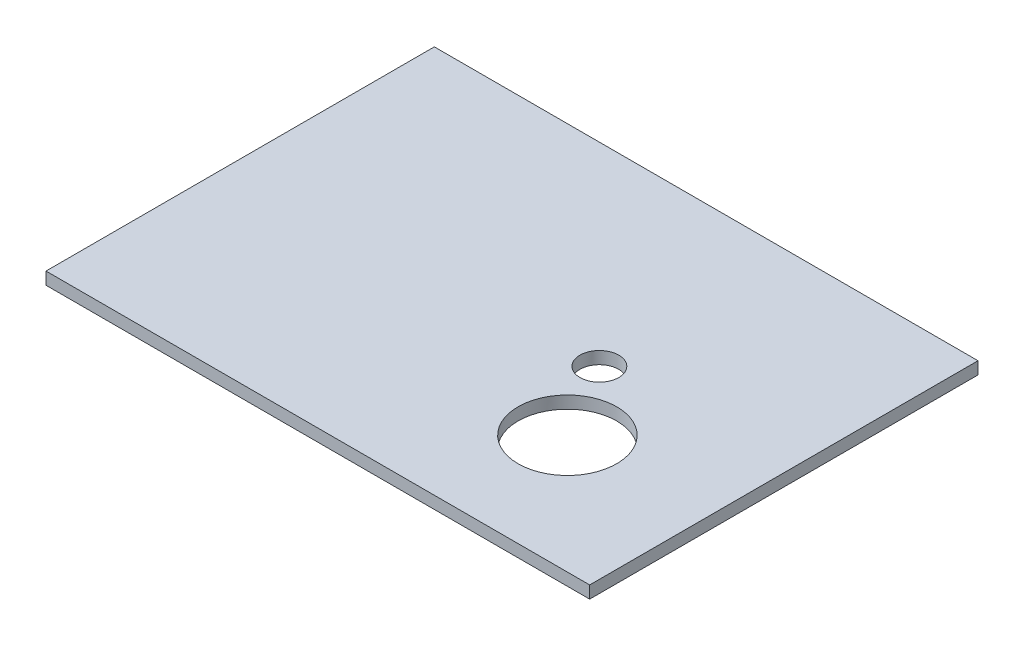
ISO-10303-21;
HEADER;
FILE_DESCRIPTION(('STEP AP214'),'2;1');
FILE_NAME('part.step','',(''),(''),'','','');
FILE_SCHEMA(('AUTOMOTIVE_DESIGN { 1 0 10303 214 1 1 1 1 }'));
ENDSEC;
DATA;
#1=APPLICATION_CONTEXT('core data for automotive mechanical design processes');
#2=APPLICATION_PROTOCOL_DEFINITION('international standard','automotive_design',2000,#1);
#3=PRODUCT_CONTEXT('',#1,'mechanical');
#4=PRODUCT('Part','Part','',(#3));
#5=PRODUCT_RELATED_PRODUCT_CATEGORY('part','',(#4));
#6=PRODUCT_DEFINITION_FORMATION('','',#4);
#7=PRODUCT_DEFINITION_CONTEXT('part definition',#1,'design');
#8=PRODUCT_DEFINITION('design','',#6,#7);
#9=PRODUCT_DEFINITION_SHAPE('','',#8);
#10=(LENGTH_UNIT() NAMED_UNIT(*) SI_UNIT(.MILLI.,.METRE.));
#11=(NAMED_UNIT(*) PLANE_ANGLE_UNIT() SI_UNIT($,.RADIAN.));
#12=(NAMED_UNIT(*) SI_UNIT($,.STERADIAN.) SOLID_ANGLE_UNIT());
#13=UNCERTAINTY_MEASURE_WITH_UNIT(LENGTH_MEASURE(1.E-05),#10,'distance_accuracy_value','');
#14=(GEOMETRIC_REPRESENTATION_CONTEXT(3) GLOBAL_UNCERTAINTY_ASSIGNED_CONTEXT((#13)) GLOBAL_UNIT_ASSIGNED_CONTEXT((#10,
#11,#12)) REPRESENTATION_CONTEXT('',''));
#15=CARTESIAN_POINT('',(0.,0.,0.));
#16=DIRECTION('',(0.,0.,1.));
#17=DIRECTION('',(1.,0.,0.));
#18=AXIS2_PLACEMENT_3D('',#15,#16,#17);
#19=CARTESIAN_POINT('',(0.,3.175,0.));
#20=DIRECTION('',(1.,0.,0.));
#21=DIRECTION('',(0.,0.,-1.));
#22=AXIS2_PLACEMENT_3D('',#19,#20,#21);
#23=PLANE('',#22);
#24=DIRECTION('',(0.,0.,1.));
#25=VECTOR('',#24,1.);
#26=CARTESIAN_POINT('',(0.,0.,0.));
#27=LINE('',#26,#25);
#28=CARTESIAN_POINT('',(0.,0.,-100.));
#29=VERTEX_POINT('',#28);
#30=CARTESIAN_POINT('',(0.,0.,0.));
#31=VERTEX_POINT('',#30);
#32=EDGE_CURVE('E99',#29,#31,#27,.T.);
#33=ORIENTED_EDGE('',*,*,#32,.T.);
#34=DIRECTION('',(0.,-1.,0.));
#35=VECTOR('',#34,1.);
#36=CARTESIAN_POINT('',(0.,3.175,0.));
#37=LINE('',#36,#35);
#38=CARTESIAN_POINT('',(0.,3.175,0.));
#39=VERTEX_POINT('',#38);
#40=EDGE_CURVE('E11',#39,#31,#37,.T.);
#41=ORIENTED_EDGE('',*,*,#40,.F.);
#42=DIRECTION('',(0.,0.,1.));
#43=VECTOR('',#42,1.);
#44=CARTESIAN_POINT('',(0.,3.175,0.));
#45=LINE('',#44,#43);
#46=CARTESIAN_POINT('',(0.,3.175,-100.));
#47=VERTEX_POINT('',#46);
#48=EDGE_CURVE('E86',#47,#39,#45,.T.);
#49=ORIENTED_EDGE('',*,*,#48,.F.);
#50=DIRECTION('',(0.,-1.,0.));
#51=VECTOR('',#50,1.);
#52=CARTESIAN_POINT('',(0.,3.175,-100.));
#53=LINE('',#52,#51);
#54=EDGE_CURVE('E95',#47,#29,#53,.T.);
#55=ORIENTED_EDGE('',*,*,#54,.T.);
#56=EDGE_LOOP('',(#33,#41,#49,#55));
#57=FACE_BOUND('',#56,.T.);
#58=ADVANCED_FACE('F33',(#57),#23,.F.);
#59=CARTESIAN_POINT('',(0.,3.175,0.));
#60=DIRECTION('',(0.,0.,-1.));
#61=DIRECTION('',(-1.,0.,0.));
#62=AXIS2_PLACEMENT_3D('',#59,#60,#61);
#63=PLANE('',#62);
#64=DIRECTION('',(1.,0.,0.));
#65=VECTOR('',#64,1.);
#66=CARTESIAN_POINT('',(0.,0.,0.));
#67=LINE('',#66,#65);
#68=CARTESIAN_POINT('',(140.,0.,0.));
#69=VERTEX_POINT('',#68);
#70=EDGE_CURVE('E90',#31,#69,#67,.T.);
#71=ORIENTED_EDGE('',*,*,#70,.T.);
#72=DIRECTION('',(0.,-1.,0.));
#73=VECTOR('',#72,1.);
#74=CARTESIAN_POINT('',(140.,3.175,0.));
#75=LINE('',#74,#73);
#76=CARTESIAN_POINT('',(140.,3.175,0.));
#77=VERTEX_POINT('',#76);
#78=EDGE_CURVE('E42',#77,#69,#75,.T.);
#79=ORIENTED_EDGE('',*,*,#78,.F.);
#80=DIRECTION('',(1.,0.,0.));
#81=VECTOR('',#80,1.);
#82=CARTESIAN_POINT('',(0.,3.175,0.));
#83=LINE('',#82,#81);
#84=EDGE_CURVE('E81',#39,#77,#83,.T.);
#85=ORIENTED_EDGE('',*,*,#84,.F.);
#86=ORIENTED_EDGE('',*,*,#40,.T.);
#87=EDGE_LOOP('',(#71,#79,#85,#86));
#88=FACE_BOUND('',#87,.T.);
#89=ADVANCED_FACE('F89',(#88),#63,.F.);
#90=CARTESIAN_POINT('',(140.,3.175,0.));
#91=DIRECTION('',(-1.,0.,0.));
#92=DIRECTION('',(0.,0.,1.));
#93=AXIS2_PLACEMENT_3D('',#90,#91,#92);
#94=PLANE('',#93);
#95=DIRECTION('',(0.,0.,-1.));
#96=VECTOR('',#95,1.);
#97=CARTESIAN_POINT('',(140.,0.,0.));
#98=LINE('',#97,#96);
#99=CARTESIAN_POINT('',(140.,0.,-100.));
#100=VERTEX_POINT('',#99);
#101=EDGE_CURVE('E68',#69,#100,#98,.T.);
#102=ORIENTED_EDGE('',*,*,#101,.T.);
#103=DIRECTION('',(0.,-1.,0.));
#104=VECTOR('',#103,1.);
#105=CARTESIAN_POINT('',(140.,3.175,-100.));
#106=LINE('',#105,#104);
#107=CARTESIAN_POINT('',(140.,3.175,-100.));
#108=VERTEX_POINT('',#107);
#109=EDGE_CURVE('E91',#108,#100,#106,.T.);
#110=ORIENTED_EDGE('',*,*,#109,.F.);
#111=DIRECTION('',(0.,0.,-1.));
#112=VECTOR('',#111,1.);
#113=CARTESIAN_POINT('',(140.,3.175,0.));
#114=LINE('',#113,#112);
#115=EDGE_CURVE('E84',#77,#108,#114,.T.);
#116=ORIENTED_EDGE('',*,*,#115,.F.);
#117=ORIENTED_EDGE('',*,*,#78,.T.);
#118=EDGE_LOOP('',(#102,#110,#116,#117));
#119=FACE_BOUND('',#118,.T.);
#120=ADVANCED_FACE('F93',(#119),#94,.F.);
#121=CARTESIAN_POINT('',(0.,3.175,-100.));
#122=DIRECTION('',(0.,0.,1.));
#123=DIRECTION('',(1.,0.,0.));
#124=AXIS2_PLACEMENT_3D('',#121,#122,#123);
#125=PLANE('',#124);
#126=DIRECTION('',(-1.,0.,0.));
#127=VECTOR('',#126,1.);
#128=CARTESIAN_POINT('',(0.,0.,-100.));
#129=LINE('',#128,#127);
#130=EDGE_CURVE('E74',#100,#29,#129,.T.);
#131=ORIENTED_EDGE('',*,*,#130,.T.);
#132=ORIENTED_EDGE('',*,*,#54,.F.);
#133=DIRECTION('',(-1.,0.,0.));
#134=VECTOR('',#133,1.);
#135=CARTESIAN_POINT('',(0.,3.175,-100.));
#136=LINE('',#135,#134);
#137=EDGE_CURVE('E51',#108,#47,#136,.T.);
#138=ORIENTED_EDGE('',*,*,#137,.F.);
#139=ORIENTED_EDGE('',*,*,#109,.T.);
#140=EDGE_LOOP('',(#131,#132,#138,#139));
#141=FACE_BOUND('',#140,.T.);
#142=ADVANCED_FACE('F125',(#141),#125,.F.);
#143=CARTESIAN_POINT('',(0.,3.175,0.));
#144=DIRECTION('',(0.,-1.,0.));
#145=DIRECTION('',(0.,0.,-1.));
#146=AXIS2_PLACEMENT_3D('',#143,#144,#145);
#147=PLANE('',#146);
#148=CARTESIAN_POINT('',(103.75,3.175,-30.5144284148501));
#149=DIRECTION('',(0.,1.,0.));
#150=DIRECTION('',(0.,0.,1.));
#151=AXIS2_PLACEMENT_3D('',#148,#149,#150);
#152=CIRCLE('',#151,12.705);
#153=CARTESIAN_POINT('',(103.75,3.175,-17.8094284148501));
#154=VERTEX_POINT('',#153);
#155=EDGE_CURVE('E108',#154,#154,#152,.T.);
#156=ORIENTED_EDGE('',*,*,#155,.F.);
#157=EDGE_LOOP('',(#156));
#158=FACE_BOUND('',#157,.T.);
#159=CARTESIAN_POINT('',(92.5,3.175,-50.));
#160=DIRECTION('',(0.,1.,0.));
#161=DIRECTION('',(0.,0.,1.));
#162=AXIS2_PLACEMENT_3D('',#159,#160,#161);
#163=CIRCLE('',#162,5.00000000000001);
#164=CARTESIAN_POINT('',(92.5,3.175,-45.));
#165=VERTEX_POINT('',#164);
#166=EDGE_CURVE('E113',#165,#165,#163,.T.);
#167=ORIENTED_EDGE('',*,*,#166,.F.);
#168=EDGE_LOOP('',(#167));
#169=FACE_BOUND('',#168,.T.);
#170=ORIENTED_EDGE('',*,*,#48,.T.);
#171=ORIENTED_EDGE('',*,*,#84,.T.);
#172=ORIENTED_EDGE('',*,*,#115,.T.);
#173=ORIENTED_EDGE('',*,*,#137,.T.);
#174=EDGE_LOOP('',(#170,#171,#172,#173));
#175=FACE_BOUND('',#174,.T.);
#176=ADVANCED_FACE('F82',(#158,#169,#175),#147,.F.);
#177=CARTESIAN_POINT('',(0.,0.,0.));
#178=DIRECTION('',(0.,-1.,0.));
#179=DIRECTION('',(0.,0.,-1.));
#180=AXIS2_PLACEMENT_3D('',#177,#178,#179);
#181=PLANE('',#180);
#182=CARTESIAN_POINT('',(103.75,0.,-30.5144284148501));
#183=DIRECTION('',(0.,-1.,0.));
#184=DIRECTION('',(0.,0.,-1.));
#185=AXIS2_PLACEMENT_3D('',#182,#183,#184);
#186=CIRCLE('',#185,12.705);
#187=CARTESIAN_POINT('',(103.75,0.,-43.2194284148501));
#188=VERTEX_POINT('',#187);
#189=EDGE_CURVE('E36',#188,#188,#186,.T.);
#190=ORIENTED_EDGE('',*,*,#189,.F.);
#191=EDGE_LOOP('',(#190));
#192=FACE_BOUND('',#191,.T.);
#193=CARTESIAN_POINT('',(92.5,0.,-50.));
#194=DIRECTION('',(0.,-1.,0.));
#195=DIRECTION('',(0.,0.,-1.));
#196=AXIS2_PLACEMENT_3D('',#193,#194,#195);
#197=CIRCLE('',#196,5.00000000000001);
#198=CARTESIAN_POINT('',(92.5,0.,-55.));
#199=VERTEX_POINT('',#198);
#200=EDGE_CURVE('E106',#199,#199,#197,.T.);
#201=ORIENTED_EDGE('',*,*,#200,.F.);
#202=EDGE_LOOP('',(#201));
#203=FACE_BOUND('',#202,.T.);
#204=ORIENTED_EDGE('',*,*,#32,.F.);
#205=ORIENTED_EDGE('',*,*,#130,.F.);
#206=ORIENTED_EDGE('',*,*,#101,.F.);
#207=ORIENTED_EDGE('',*,*,#70,.F.);
#208=EDGE_LOOP('',(#204,#205,#206,#207));
#209=FACE_BOUND('',#208,.T.);
#210=ADVANCED_FACE('F124',(#192,#203,#209),#181,.T.);
#211=CARTESIAN_POINT('',(92.5,-6.825,-50.));
#212=DIRECTION('',(0.,1.,0.));
#213=DIRECTION('',(0.,0.,1.));
#214=AXIS2_PLACEMENT_3D('',#211,#212,#213);
#215=CYLINDRICAL_SURFACE('',#214,5.00000000000001);
#216=ORIENTED_EDGE('',*,*,#200,.T.);
#217=EDGE_LOOP('',(#216));
#218=FACE_BOUND('',#217,.T.);
#219=ORIENTED_EDGE('',*,*,#166,.T.);
#220=EDGE_LOOP('',(#219));
#221=FACE_BOUND('',#220,.T.);
#222=ADVANCED_FACE('F121',(#218,#221),#215,.F.);
#223=CARTESIAN_POINT('',(103.75,-6.825,-30.5144284148501));
#224=DIRECTION('',(0.,1.,0.));
#225=DIRECTION('',(0.,0.,1.));
#226=AXIS2_PLACEMENT_3D('',#223,#224,#225);
#227=CYLINDRICAL_SURFACE('',#226,12.705);
#228=ORIENTED_EDGE('',*,*,#189,.T.);
#229=EDGE_LOOP('',(#228));
#230=FACE_BOUND('',#229,.T.);
#231=ORIENTED_EDGE('',*,*,#155,.T.);
#232=EDGE_LOOP('',(#231));
#233=FACE_BOUND('',#232,.T.);
#234=ADVANCED_FACE('F172',(#230,#233),#227,.F.);
#235=CLOSED_SHELL('',(#58,#89,#120,#142,#176,#210,#222,#234));
#236=MANIFOLD_SOLID_BREP('B2',#235);
#237=ADVANCED_BREP_SHAPE_REPRESENTATION('',(#18,#236),#14);
#238=SHAPE_DEFINITION_REPRESENTATION(#9,#237);
ENDSEC;
END-ISO-10303-21;
